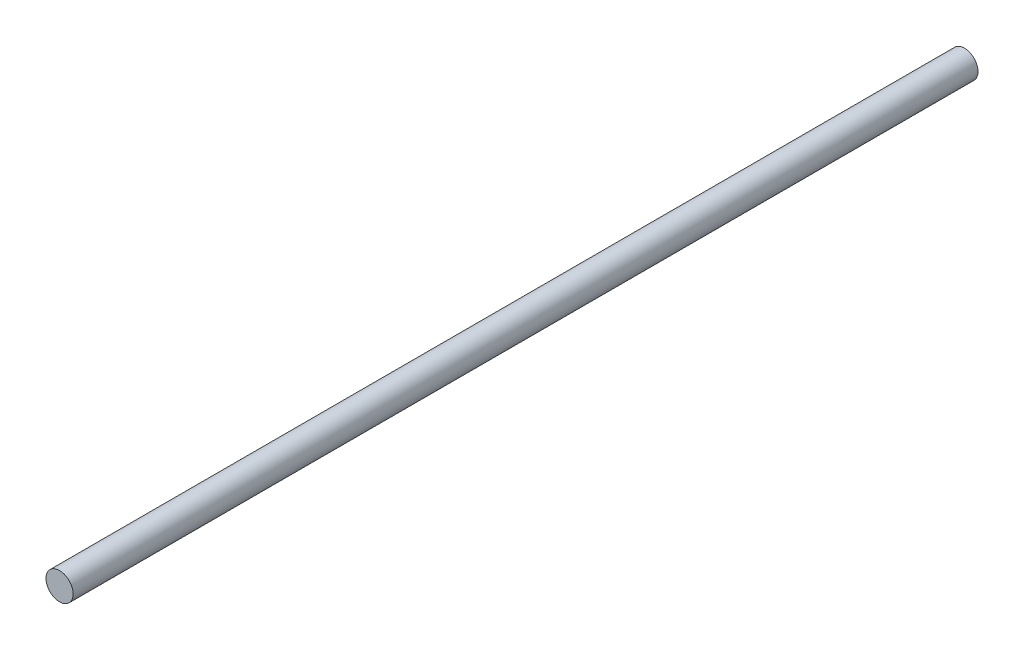
ISO-10303-21;
HEADER;
FILE_DESCRIPTION(('STEP AP214'),'2;1');
FILE_NAME('part.step','',(''),(''),'','','');
FILE_SCHEMA(('AUTOMOTIVE_DESIGN { 1 0 10303 214 1 1 1 1 }'));
ENDSEC;
DATA;
#1=APPLICATION_CONTEXT('core data for automotive mechanical design processes');
#2=APPLICATION_PROTOCOL_DEFINITION('international standard','automotive_design',2000,#1);
#3=PRODUCT_CONTEXT('',#1,'mechanical');
#4=PRODUCT('Part','Part','',(#3));
#5=PRODUCT_RELATED_PRODUCT_CATEGORY('part','',(#4));
#6=PRODUCT_DEFINITION_FORMATION('','',#4);
#7=PRODUCT_DEFINITION_CONTEXT('part definition',#1,'design');
#8=PRODUCT_DEFINITION('design','',#6,#7);
#9=PRODUCT_DEFINITION_SHAPE('','',#8);
#10=(LENGTH_UNIT() NAMED_UNIT(*) SI_UNIT(.MILLI.,.METRE.));
#11=(NAMED_UNIT(*) PLANE_ANGLE_UNIT() SI_UNIT($,.RADIAN.));
#12=(NAMED_UNIT(*) SI_UNIT($,.STERADIAN.) SOLID_ANGLE_UNIT());
#13=UNCERTAINTY_MEASURE_WITH_UNIT(LENGTH_MEASURE(1.E-05),#10,'distance_accuracy_value','');
#14=(GEOMETRIC_REPRESENTATION_CONTEXT(3) GLOBAL_UNCERTAINTY_ASSIGNED_CONTEXT((#13)) GLOBAL_UNIT_ASSIGNED_CONTEXT((#10,
#11,#12)) REPRESENTATION_CONTEXT('',''));
#15=CARTESIAN_POINT('',(0.,0.,0.));
#16=DIRECTION('',(0.,0.,1.));
#17=DIRECTION('',(1.,0.,0.));
#18=AXIS2_PLACEMENT_3D('',#15,#16,#17);
#19=CARTESIAN_POINT('',(0.,0.,400.));
#20=DIRECTION('',(0.,0.,-1.));
#21=DIRECTION('',(-1.,0.,0.));
#22=AXIS2_PLACEMENT_3D('',#19,#20,#21);
#23=CYLINDRICAL_SURFACE('',#22,6.);
#24=CARTESIAN_POINT('',(0.,0.,400.));
#25=DIRECTION('',(0.,0.,1.));
#26=DIRECTION('',(1.,0.,0.));
#27=AXIS2_PLACEMENT_3D('',#24,#25,#26);
#28=CIRCLE('',#27,6.);
#29=CARTESIAN_POINT('',(6.,0.,400.));
#30=VERTEX_POINT('',#29);
#31=EDGE_CURVE('E10',#30,#30,#28,.T.);
#32=ORIENTED_EDGE('',*,*,#31,.F.);
#33=EDGE_LOOP('',(#32));
#34=FACE_BOUND('',#33,.T.);
#35=CARTESIAN_POINT('',(0.,0.,0.));
#36=DIRECTION('',(0.,0.,1.));
#37=DIRECTION('',(1.,0.,0.));
#38=AXIS2_PLACEMENT_3D('',#35,#36,#37);
#39=CIRCLE('',#38,6.);
#40=CARTESIAN_POINT('',(6.,0.,0.));
#41=VERTEX_POINT('',#40);
#42=EDGE_CURVE('E33',#41,#41,#39,.T.);
#43=ORIENTED_EDGE('',*,*,#42,.T.);
#44=EDGE_LOOP('',(#43));
#45=FACE_BOUND('',#44,.T.);
#46=ADVANCED_FACE('F30',(#34,#45),#23,.T.);
#47=CARTESIAN_POINT('',(0.,0.,400.));
#48=DIRECTION('',(0.,0.,1.));
#49=DIRECTION('',(1.,0.,0.));
#50=AXIS2_PLACEMENT_3D('',#47,#48,#49);
#51=PLANE('',#50);
#52=ORIENTED_EDGE('',*,*,#31,.T.);
#53=EDGE_LOOP('',(#52));
#54=FACE_BOUND('',#53,.T.);
#55=ADVANCED_FACE('F45',(#54),#51,.T.);
#56=CARTESIAN_POINT('',(0.,0.,0.));
#57=DIRECTION('',(0.,0.,1.));
#58=DIRECTION('',(1.,0.,0.));
#59=AXIS2_PLACEMENT_3D('',#56,#57,#58);
#60=PLANE('',#59);
#61=ORIENTED_EDGE('',*,*,#42,.F.);
#62=EDGE_LOOP('',(#61));
#63=FACE_BOUND('',#62,.T.);
#64=ADVANCED_FACE('F43',(#63),#60,.F.);
#65=CLOSED_SHELL('',(#46,#55,#64));
#66=MANIFOLD_SOLID_BREP('B2',#65);
#67=ADVANCED_BREP_SHAPE_REPRESENTATION('',(#18,#66),#14);
#68=SHAPE_DEFINITION_REPRESENTATION(#9,#67);
ENDSEC;
END-ISO-10303-21;
